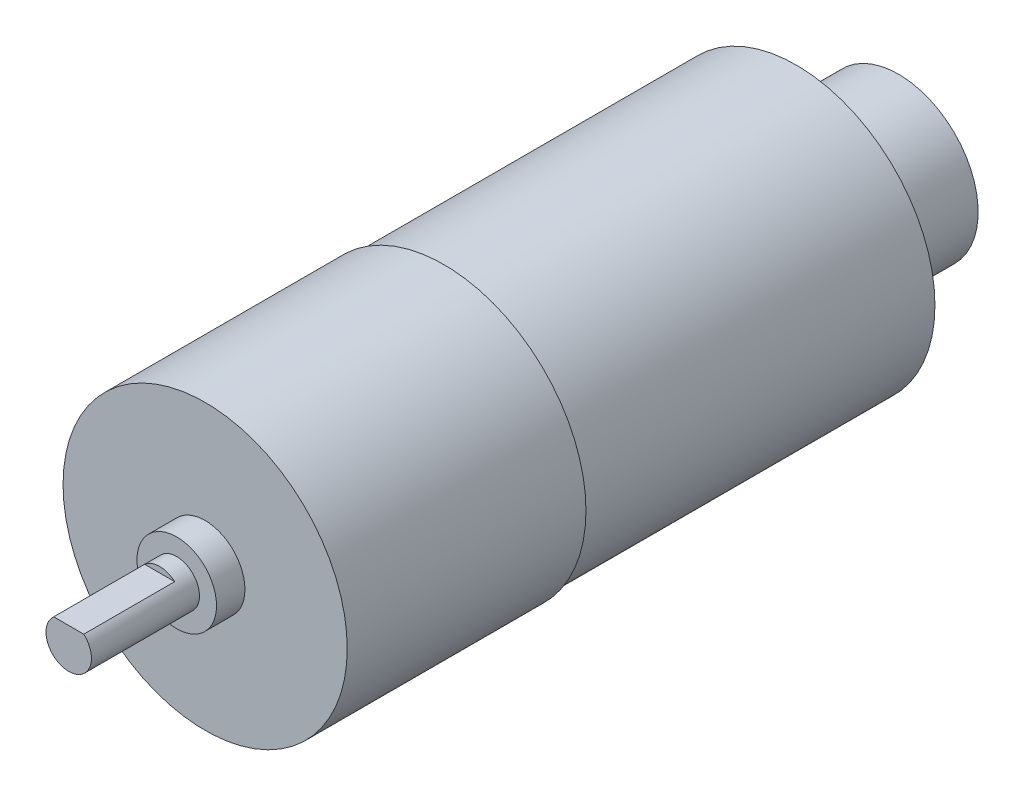
ISO-10303-21;
HEADER;
FILE_DESCRIPTION(('STEP AP214'),'2;1');
FILE_NAME('part.step','',(''),(''),'','','');
FILE_SCHEMA(('AUTOMOTIVE_DESIGN { 1 0 10303 214 1 1 1 1 }'));
ENDSEC;
DATA;
#1=APPLICATION_CONTEXT('core data for automotive mechanical design processes');
#2=APPLICATION_PROTOCOL_DEFINITION('international standard','automotive_design',2000,#1);
#3=PRODUCT_CONTEXT('',#1,'mechanical');
#4=PRODUCT('Part','Part','',(#3));
#5=PRODUCT_RELATED_PRODUCT_CATEGORY('part','',(#4));
#6=PRODUCT_DEFINITION_FORMATION('','',#4);
#7=PRODUCT_DEFINITION_CONTEXT('part definition',#1,'design');
#8=PRODUCT_DEFINITION('design','',#6,#7);
#9=PRODUCT_DEFINITION_SHAPE('','',#8);
#10=(LENGTH_UNIT() NAMED_UNIT(*) SI_UNIT(.MILLI.,.METRE.));
#11=(NAMED_UNIT(*) PLANE_ANGLE_UNIT() SI_UNIT($,.RADIAN.));
#12=(NAMED_UNIT(*) SI_UNIT($,.STERADIAN.) SOLID_ANGLE_UNIT());
#13=UNCERTAINTY_MEASURE_WITH_UNIT(LENGTH_MEASURE(1.E-05),#10,'distance_accuracy_value','');
#14=(GEOMETRIC_REPRESENTATION_CONTEXT(3) GLOBAL_UNCERTAINTY_ASSIGNED_CONTEXT((#13)) GLOBAL_UNIT_ASSIGNED_CONTEXT((#10,
#11,#12)) REPRESENTATION_CONTEXT('',''));
#15=CARTESIAN_POINT('',(0.,0.,0.));
#16=DIRECTION('',(0.,0.,1.));
#17=DIRECTION('',(1.,0.,0.));
#18=AXIS2_PLACEMENT_3D('',#15,#16,#17);
#19=CARTESIAN_POINT('',(0.,0.,31.));
#20=DIRECTION('',(0.,0.,-1.));
#21=DIRECTION('',(-1.,0.,0.));
#22=AXIS2_PLACEMENT_3D('',#19,#20,#21);
#23=CYLINDRICAL_SURFACE('',#22,12.2);
#24=CARTESIAN_POINT('',(0.,0.,31.));
#25=DIRECTION('',(0.,0.,1.));
#26=DIRECTION('',(1.,0.,0.));
#27=AXIS2_PLACEMENT_3D('',#24,#25,#26);
#28=CIRCLE('',#27,12.2);
#29=CARTESIAN_POINT('',(12.2,0.,31.));
#30=VERTEX_POINT('',#29);
#31=EDGE_CURVE('E100',#30,#30,#28,.T.);
#32=ORIENTED_EDGE('',*,*,#31,.F.);
#33=EDGE_LOOP('',(#32));
#34=FACE_BOUND('',#33,.T.);
#35=CARTESIAN_POINT('',(0.,0.,0.));
#36=DIRECTION('',(0.,0.,1.));
#37=DIRECTION('',(1.,0.,0.));
#38=AXIS2_PLACEMENT_3D('',#35,#36,#37);
#39=CIRCLE('',#38,12.2);
#40=CARTESIAN_POINT('',(12.2,0.,0.));
#41=VERTEX_POINT('',#40);
#42=EDGE_CURVE('E104',#41,#41,#39,.T.);
#43=ORIENTED_EDGE('',*,*,#42,.T.);
#44=EDGE_LOOP('',(#43));
#45=FACE_BOUND('',#44,.T.);
#46=ADVANCED_FACE('F47',(#34,#45),#23,.T.);
#47=CARTESIAN_POINT('',(0.,0.,0.));
#48=DIRECTION('',(0.,0.,1.));
#49=DIRECTION('',(1.,0.,0.));
#50=AXIS2_PLACEMENT_3D('',#47,#48,#49);
#51=PLANE('',#50);
#52=CARTESIAN_POINT('',(0.,0.,0.));
#53=DIRECTION('',(0.,0.,1.));
#54=DIRECTION('',(1.,0.,0.));
#55=AXIS2_PLACEMENT_3D('',#52,#53,#54);
#56=CIRCLE('',#55,0.5);
#57=CARTESIAN_POINT('',(0.5,0.,0.));
#58=VERTEX_POINT('',#57);
#59=EDGE_CURVE('E11',#58,#58,#56,.F.);
#60=ORIENTED_EDGE('',*,*,#59,.F.);
#61=EDGE_LOOP('',(#60));
#62=FACE_BOUND('',#61,.T.);
#63=ORIENTED_EDGE('',*,*,#42,.F.);
#64=EDGE_LOOP('',(#63));
#65=FACE_BOUND('',#64,.T.);
#66=ADVANCED_FACE('F112',(#62,#65),#51,.F.);
#67=CARTESIAN_POINT('',(0.,0.,52.));
#68=DIRECTION('',(0.,0.,-1.));
#69=DIRECTION('',(-1.,0.,0.));
#70=AXIS2_PLACEMENT_3D('',#67,#68,#69);
#71=CYLINDRICAL_SURFACE('',#70,12.5);
#72=CARTESIAN_POINT('',(0.,0.,52.));
#73=DIRECTION('',(0.,0.,1.));
#74=DIRECTION('',(1.,0.,0.));
#75=AXIS2_PLACEMENT_3D('',#72,#73,#74);
#76=CIRCLE('',#75,12.5);
#77=CARTESIAN_POINT('',(-12.5,0.,52.));
#78=VERTEX_POINT('',#77);
#79=EDGE_CURVE('E101',#78,#78,#76,.T.);
#80=CARTESIAN_POINT('',(0.,0.,31.));
#81=DIRECTION('',(0.,0.,1.));
#82=DIRECTION('',(1.,0.,0.));
#83=AXIS2_PLACEMENT_3D('',#80,#81,#82);
#84=CIRCLE('',#83,12.5);
#85=CARTESIAN_POINT('',(-12.5,0.,31.));
#86=VERTEX_POINT('',#85);
#87=EDGE_CURVE('E97',#86,#86,#84,.T.);
#88=CARTESIAN_POINT('',(-12.5,0.,52.));
#89=CARTESIAN_POINT('',(-12.5,0.,51.78125));
#90=CARTESIAN_POINT('',(-12.5,0.,51.5625));
#91=CARTESIAN_POINT('',(-12.5,0.,51.125));
#92=CARTESIAN_POINT('',(-12.5,0.,50.90625));
#93=CARTESIAN_POINT('',(-12.5,0.,50.46875));
#94=CARTESIAN_POINT('',(-12.5,0.,50.25));
#95=CARTESIAN_POINT('',(-12.5,0.,49.8125));
#96=CARTESIAN_POINT('',(-12.5,0.,49.59375));
#97=CARTESIAN_POINT('',(-12.5,0.,49.15625));
#98=CARTESIAN_POINT('',(-12.5,0.,48.9375));
#99=CARTESIAN_POINT('',(-12.5,0.,48.5));
#100=CARTESIAN_POINT('',(-12.5,0.,48.28125));
#101=CARTESIAN_POINT('',(-12.5,0.,47.84375));
#102=CARTESIAN_POINT('',(-12.5,0.,47.625));
#103=CARTESIAN_POINT('',(-12.5,0.,47.1875));
#104=CARTESIAN_POINT('',(-12.5,0.,46.96875));
#105=CARTESIAN_POINT('',(-12.5,0.,46.53125));
#106=CARTESIAN_POINT('',(-12.5,0.,46.3125));
#107=CARTESIAN_POINT('',(-12.5,0.,45.875));
#108=CARTESIAN_POINT('',(-12.5,0.,45.65625));
#109=CARTESIAN_POINT('',(-12.5,0.,45.21875));
#110=CARTESIAN_POINT('',(-12.5,0.,45.));
#111=CARTESIAN_POINT('',(-12.5,0.,44.5625));
#112=CARTESIAN_POINT('',(-12.5,0.,44.34375));
#113=CARTESIAN_POINT('',(-12.5,0.,43.90625));
#114=CARTESIAN_POINT('',(-12.5,0.,43.6875));
#115=CARTESIAN_POINT('',(-12.5,0.,43.25));
#116=CARTESIAN_POINT('',(-12.5,0.,43.03125));
#117=CARTESIAN_POINT('',(-12.5,0.,42.59375));
#118=CARTESIAN_POINT('',(-12.5,0.,42.375));
#119=CARTESIAN_POINT('',(-12.5,0.,41.9375));
#120=CARTESIAN_POINT('',(-12.5,0.,41.71875));
#121=CARTESIAN_POINT('',(-12.5,0.,41.28125));
#122=CARTESIAN_POINT('',(-12.5,0.,41.0625));
#123=CARTESIAN_POINT('',(-12.5,0.,40.625));
#124=CARTESIAN_POINT('',(-12.5,0.,40.40625));
#125=CARTESIAN_POINT('',(-12.5,0.,39.96875));
#126=CARTESIAN_POINT('',(-12.5,0.,39.75));
#127=CARTESIAN_POINT('',(-12.5,0.,39.3125));
#128=CARTESIAN_POINT('',(-12.5,0.,39.09375));
#129=CARTESIAN_POINT('',(-12.5,0.,38.65625));
#130=CARTESIAN_POINT('',(-12.5,0.,38.4375));
#131=CARTESIAN_POINT('',(-12.5,0.,38.));
#132=CARTESIAN_POINT('',(-12.5,0.,37.78125));
#133=CARTESIAN_POINT('',(-12.5,0.,37.34375));
#134=CARTESIAN_POINT('',(-12.5,0.,37.125));
#135=CARTESIAN_POINT('',(-12.5,0.,36.6875));
#136=CARTESIAN_POINT('',(-12.5,0.,36.46875));
#137=CARTESIAN_POINT('',(-12.5,0.,36.03125));
#138=CARTESIAN_POINT('',(-12.5,0.,35.8125));
#139=CARTESIAN_POINT('',(-12.5,0.,35.375));
#140=CARTESIAN_POINT('',(-12.5,0.,35.15625));
#141=CARTESIAN_POINT('',(-12.5,0.,34.71875));
#142=CARTESIAN_POINT('',(-12.5,0.,34.5));
#143=CARTESIAN_POINT('',(-12.5,0.,34.0625));
#144=CARTESIAN_POINT('',(-12.5,0.,33.84375));
#145=CARTESIAN_POINT('',(-12.5,0.,33.40625));
#146=CARTESIAN_POINT('',(-12.5,0.,33.1875));
#147=CARTESIAN_POINT('',(-12.5,0.,32.75));
#148=CARTESIAN_POINT('',(-12.5,0.,32.53125));
#149=CARTESIAN_POINT('',(-12.5,0.,32.09375));
#150=CARTESIAN_POINT('',(-12.5,0.,31.875));
#151=CARTESIAN_POINT('',(-12.5,0.,31.4375));
#152=CARTESIAN_POINT('',(-12.5,0.,31.21875));
#153=CARTESIAN_POINT('',(-12.5,0.,31.));
#154=B_SPLINE_CURVE_WITH_KNOTS('',3,(#88,#89,#90,#91,#92,#93,#94,#95,#96,#97,#98,#99,#100,#101,
#102,#103,#104,#105,#106,#107,#108,#109,#110,#111,#112,#113,#114,#115,#116,#117,#118,#119,#120,
#121,#122,#123,#124,#125,#126,#127,#128,#129,#130,#131,#132,#133,#134,#135,#136,#137,#138,#139,
#140,#141,#142,#143,#144,#145,#146,#147,#148,#149,#150,#151,#152,#153),.UNSPECIFIED.,.F.,.F.,(4,
2,2,2,2,2,2,2,2,2,2,2,2,2,2,2,2,2,2,2,2,2,2,2,2,2,2,2,2,2,2,2,4),(0.,0.656250000000004,1.3125,
1.96875000000001,2.625,3.28125000000001,3.9375,4.59375000000001,5.25,5.90625,6.56250000000001,
7.21875,7.87500000000001,8.53125,9.1875,9.84375000000001,10.5,11.15625,11.8125,12.46875,13.125,
13.78125,14.4375,15.09375,15.75,16.40625,17.0625,17.71875,18.375,19.03125,19.6875,20.34375,21.),.UNSPECIFIED.);
#155=EDGE_CURVE('BSEAM114',#78,#86,#154,.T.);
#156=ORIENTED_EDGE('',*,*,#79,.F.);
#157=ORIENTED_EDGE('',*,*,#87,.T.);
#158=ORIENTED_EDGE('',*,*,#155,.T.);
#159=ORIENTED_EDGE('',*,*,#155,.F.);
#160=EDGE_LOOP('',(#156,#158,#157,#159));
#161=FACE_BOUND('',#160,.T.);
#162=ADVANCED_FACE('F114',(#161),#71,.T.);
#163=CARTESIAN_POINT('',(0.,0.,52.));
#164=DIRECTION('',(0.,0.,1.));
#165=DIRECTION('',(1.,0.,0.));
#166=AXIS2_PLACEMENT_3D('',#163,#164,#165);
#167=PLANE('',#166);
#168=CARTESIAN_POINT('',(0.,0.,52.));
#169=DIRECTION('',(0.,0.,1.));
#170=DIRECTION('',(1.,0.,0.));
#171=AXIS2_PLACEMENT_3D('',#168,#169,#170);
#172=CIRCLE('',#171,3.5);
#173=CARTESIAN_POINT('',(3.5,0.,52.));
#174=VERTEX_POINT('',#173);
#175=EDGE_CURVE('E94',#174,#174,#172,.T.);
#176=ORIENTED_EDGE('',*,*,#175,.F.);
#177=EDGE_LOOP('',(#176));
#178=FACE_BOUND('',#177,.T.);
#179=ORIENTED_EDGE('',*,*,#79,.T.);
#180=EDGE_LOOP('',(#179));
#181=FACE_BOUND('',#180,.T.);
#182=ADVANCED_FACE('F120',(#178,#181),#167,.T.);
#183=CARTESIAN_POINT('',(0.,0.,31.));
#184=DIRECTION('',(0.,0.,1.));
#185=DIRECTION('',(1.,0.,0.));
#186=AXIS2_PLACEMENT_3D('',#183,#184,#185);
#187=PLANE('',#186);
#188=ORIENTED_EDGE('',*,*,#31,.T.);
#189=EDGE_LOOP('',(#188));
#190=FACE_BOUND('',#189,.T.);
#191=ORIENTED_EDGE('',*,*,#87,.F.);
#192=EDGE_LOOP('',(#191));
#193=FACE_BOUND('',#192,.T.);
#194=ADVANCED_FACE('F126',(#190,#193),#187,.F.);
#195=CARTESIAN_POINT('',(0.,0.,54.5));
#196=DIRECTION('',(0.,0.,-1.));
#197=DIRECTION('',(-1.,0.,0.));
#198=AXIS2_PLACEMENT_3D('',#195,#196,#197);
#199=CYLINDRICAL_SURFACE('',#198,3.5);
#200=CARTESIAN_POINT('',(0.,0.,54.5));
#201=DIRECTION('',(0.,0.,1.));
#202=DIRECTION('',(1.,0.,0.));
#203=AXIS2_PLACEMENT_3D('',#200,#201,#202);
#204=CIRCLE('',#203,3.5);
#205=CARTESIAN_POINT('',(3.5,0.,54.5));
#206=VERTEX_POINT('',#205);
#207=EDGE_CURVE('E79',#206,#206,#204,.T.);
#208=ORIENTED_EDGE('',*,*,#207,.F.);
#209=EDGE_LOOP('',(#208));
#210=FACE_BOUND('',#209,.T.);
#211=ORIENTED_EDGE('',*,*,#175,.T.);
#212=EDGE_LOOP('',(#211));
#213=FACE_BOUND('',#212,.T.);
#214=ADVANCED_FACE('F129',(#210,#213),#199,.T.);
#215=CARTESIAN_POINT('',(0.,0.,54.5));
#216=DIRECTION('',(0.,0.,1.));
#217=DIRECTION('',(1.,0.,0.));
#218=AXIS2_PLACEMENT_3D('',#215,#216,#217);
#219=PLANE('',#218);
#220=CARTESIAN_POINT('',(0.,0.,54.5));
#221=DIRECTION('',(0.,0.,1.));
#222=DIRECTION('',(1.,0.,0.));
#223=AXIS2_PLACEMENT_3D('',#220,#221,#222);
#224=CIRCLE('',#223,2.);
#225=CARTESIAN_POINT('',(2.,0.,54.5));
#226=VERTEX_POINT('',#225);
#227=EDGE_CURVE('E54',#226,#226,#224,.T.);
#228=ORIENTED_EDGE('',*,*,#227,.F.);
#229=EDGE_LOOP('',(#228));
#230=FACE_BOUND('',#229,.T.);
#231=ORIENTED_EDGE('',*,*,#207,.T.);
#232=EDGE_LOOP('',(#231));
#233=FACE_BOUND('',#232,.T.);
#234=ADVANCED_FACE('F136',(#230,#233),#219,.T.);
#235=CARTESIAN_POINT('',(0.,0.,56.));
#236=DIRECTION('',(0.,0.,-1.));
#237=DIRECTION('',(-1.,0.,0.));
#238=AXIS2_PLACEMENT_3D('',#235,#236,#237);
#239=CYLINDRICAL_SURFACE('',#238,2.);
#240=CARTESIAN_POINT('',(0.,0.,56.));
#241=DIRECTION('',(0.,0.,1.));
#242=DIRECTION('',(1.,0.,0.));
#243=AXIS2_PLACEMENT_3D('',#240,#241,#242);
#244=CIRCLE('',#243,2.);
#245=CARTESIAN_POINT('',(1.3228756555323,1.5,56.));
#246=VERTEX_POINT('',#245);
#247=CARTESIAN_POINT('',(-1.3228756555323,1.5,56.));
#248=VERTEX_POINT('',#247);
#249=EDGE_CURVE('E74',#246,#248,#244,.T.);
#250=ORIENTED_EDGE('',*,*,#249,.F.);
#251=DIRECTION('',(0.,0.,-1.));
#252=VECTOR('',#251,1.);
#253=CARTESIAN_POINT('',(1.3228756555323,1.5,64.));
#254=LINE('',#253,#252);
#255=CARTESIAN_POINT('',(1.3228756555323,1.5,64.));
#256=VERTEX_POINT('',#255);
#257=EDGE_CURVE('E83',#256,#246,#254,.T.);
#258=ORIENTED_EDGE('',*,*,#257,.F.);
#259=CARTESIAN_POINT('',(0.,0.,64.));
#260=DIRECTION('',(0.,0.,1.));
#261=DIRECTION('',(1.,0.,0.));
#262=AXIS2_PLACEMENT_3D('',#259,#260,#261);
#263=CIRCLE('',#262,2.);
#264=CARTESIAN_POINT('',(-1.3228756555323,1.5,64.));
#265=VERTEX_POINT('',#264);
#266=EDGE_CURVE('E88',#265,#256,#263,.T.);
#267=ORIENTED_EDGE('',*,*,#266,.F.);
#268=DIRECTION('',(0.,0.,-1.));
#269=VECTOR('',#268,1.);
#270=CARTESIAN_POINT('',(-1.3228756555323,1.5,64.));
#271=LINE('',#270,#269);
#272=EDGE_CURVE('E80',#265,#248,#271,.T.);
#273=ORIENTED_EDGE('',*,*,#272,.T.);
#274=EDGE_LOOP('',(#250,#258,#267,#273));
#275=FACE_BOUND('',#274,.T.);
#276=ORIENTED_EDGE('',*,*,#227,.T.);
#277=EDGE_LOOP('',(#276));
#278=FACE_BOUND('',#277,.T.);
#279=ADVANCED_FACE('F86',(#275,#278),#239,.T.);
#280=CARTESIAN_POINT('',(0.,0.,56.));
#281=DIRECTION('',(0.,0.,1.));
#282=DIRECTION('',(1.,0.,0.));
#283=AXIS2_PLACEMENT_3D('',#280,#281,#282);
#284=PLANE('',#283);
#285=DIRECTION('',(-1.,0.,0.));
#286=VECTOR('',#285,1.);
#287=CARTESIAN_POINT('',(0.,1.5,56.));
#288=LINE('',#287,#286);
#289=EDGE_CURVE('E60',#246,#248,#288,.T.);
#290=ORIENTED_EDGE('',*,*,#289,.F.);
#291=ORIENTED_EDGE('',*,*,#249,.T.);
#292=EDGE_LOOP('',(#290,#291));
#293=FACE_BOUND('',#292,.T.);
#294=ADVANCED_FACE('F75',(#293),#284,.T.);
#295=CARTESIAN_POINT('',(0.,1.5,64.));
#296=DIRECTION('',(0.,-1.,0.));
#297=DIRECTION('',(0.,0.,-1.));
#298=AXIS2_PLACEMENT_3D('',#295,#296,#297);
#299=PLANE('',#298);
#300=ORIENTED_EDGE('',*,*,#289,.T.);
#301=ORIENTED_EDGE('',*,*,#272,.F.);
#302=DIRECTION('',(-1.,0.,0.));
#303=VECTOR('',#302,1.);
#304=CARTESIAN_POINT('',(0.,1.5,64.));
#305=LINE('',#304,#303);
#306=EDGE_CURVE('E69',#256,#265,#305,.T.);
#307=ORIENTED_EDGE('',*,*,#306,.F.);
#308=ORIENTED_EDGE('',*,*,#257,.T.);
#309=EDGE_LOOP('',(#300,#301,#307,#308));
#310=FACE_BOUND('',#309,.T.);
#311=ADVANCED_FACE('F82',(#310),#299,.F.);
#312=CARTESIAN_POINT('',(0.,0.,64.));
#313=DIRECTION('',(0.,0.,1.));
#314=DIRECTION('',(1.,0.,0.));
#315=AXIS2_PLACEMENT_3D('',#312,#313,#314);
#316=PLANE('',#315);
#317=ORIENTED_EDGE('',*,*,#306,.T.);
#318=ORIENTED_EDGE('',*,*,#266,.T.);
#319=EDGE_LOOP('',(#317,#318));
#320=FACE_BOUND('',#319,.T.);
#321=ADVANCED_FACE('F147',(#320),#316,.T.);
#322=CARTESIAN_POINT('',(0.,0.,-1.));
#323=DIRECTION('',(0.,0.,1.));
#324=DIRECTION('',(1.,0.,0.));
#325=AXIS2_PLACEMENT_3D('',#322,#323,#324);
#326=CYLINDRICAL_SURFACE('',#325,0.5);
#327=CARTESIAN_POINT('',(0.,0.,-1.));
#328=DIRECTION('',(0.,0.,-1.));
#329=DIRECTION('',(-1.,0.,0.));
#330=AXIS2_PLACEMENT_3D('',#327,#328,#329);
#331=CIRCLE('',#330,0.5);
#332=CARTESIAN_POINT('',(-0.5,0.,-1.));
#333=VERTEX_POINT('',#332);
#334=EDGE_CURVE('E84',#333,#333,#331,.T.);
#335=ORIENTED_EDGE('',*,*,#334,.F.);
#336=EDGE_LOOP('',(#335));
#337=FACE_BOUND('',#336,.T.);
#338=ORIENTED_EDGE('',*,*,#59,.T.);
#339=EDGE_LOOP('',(#338));
#340=FACE_BOUND('',#339,.T.);
#341=ADVANCED_FACE('F150',(#337,#340),#326,.T.);
#342=CARTESIAN_POINT('',(0.,0.,-9.));
#343=DIRECTION('',(0.,0.,1.));
#344=DIRECTION('',(1.,0.,0.));
#345=AXIS2_PLACEMENT_3D('',#342,#343,#344);
#346=CYLINDRICAL_SURFACE('',#345,7.);
#347=CARTESIAN_POINT('',(0.,0.,-9.));
#348=DIRECTION('',(0.,0.,-1.));
#349=DIRECTION('',(-1.,0.,0.));
#350=AXIS2_PLACEMENT_3D('',#347,#348,#349);
#351=CIRCLE('',#350,7.);
#352=CARTESIAN_POINT('',(-7.,0.,-9.));
#353=VERTEX_POINT('',#352);
#354=EDGE_CURVE('E170',#353,#353,#351,.T.);
#355=ORIENTED_EDGE('',*,*,#354,.F.);
#356=EDGE_LOOP('',(#355));
#357=FACE_BOUND('',#356,.T.);
#358=CARTESIAN_POINT('',(0.,0.,-1.));
#359=DIRECTION('',(0.,0.,-1.));
#360=DIRECTION('',(-1.,0.,0.));
#361=AXIS2_PLACEMENT_3D('',#358,#359,#360);
#362=CIRCLE('',#361,7.);
#363=CARTESIAN_POINT('',(-7.,0.,-1.));
#364=VERTEX_POINT('',#363);
#365=EDGE_CURVE('E171',#364,#364,#362,.T.);
#366=ORIENTED_EDGE('',*,*,#365,.T.);
#367=EDGE_LOOP('',(#366));
#368=FACE_BOUND('',#367,.T.);
#369=ADVANCED_FACE('F154',(#357,#368),#346,.T.);
#370=CARTESIAN_POINT('',(0.,0.,-9.));
#371=DIRECTION('',(0.,0.,-1.));
#372=DIRECTION('',(-1.,0.,0.));
#373=AXIS2_PLACEMENT_3D('',#370,#371,#372);
#374=PLANE('',#373);
#375=ORIENTED_EDGE('',*,*,#354,.T.);
#376=EDGE_LOOP('',(#375));
#377=FACE_BOUND('',#376,.T.);
#378=ADVANCED_FACE('F158',(#377),#374,.T.);
#379=CARTESIAN_POINT('',(0.,0.,-1.));
#380=DIRECTION('',(0.,0.,-1.));
#381=DIRECTION('',(-1.,0.,0.));
#382=AXIS2_PLACEMENT_3D('',#379,#380,#381);
#383=PLANE('',#382);
#384=ORIENTED_EDGE('',*,*,#334,.T.);
#385=EDGE_LOOP('',(#384));
#386=FACE_BOUND('',#385,.T.);
#387=ORIENTED_EDGE('',*,*,#365,.F.);
#388=EDGE_LOOP('',(#387));
#389=FACE_BOUND('',#388,.T.);
#390=ADVANCED_FACE('F160',(#386,#389),#383,.F.);
#391=CLOSED_SHELL('',(#46,#66,#162,#182,#194,#214,#234,#279,#294,#311,#321,#341,#369,#378,#390));
#392=MANIFOLD_SOLID_BREP('B2',#391);
#393=ADVANCED_BREP_SHAPE_REPRESENTATION('',(#18,#392),#14);
#394=SHAPE_DEFINITION_REPRESENTATION(#9,#393);
ENDSEC;
END-ISO-10303-21;
